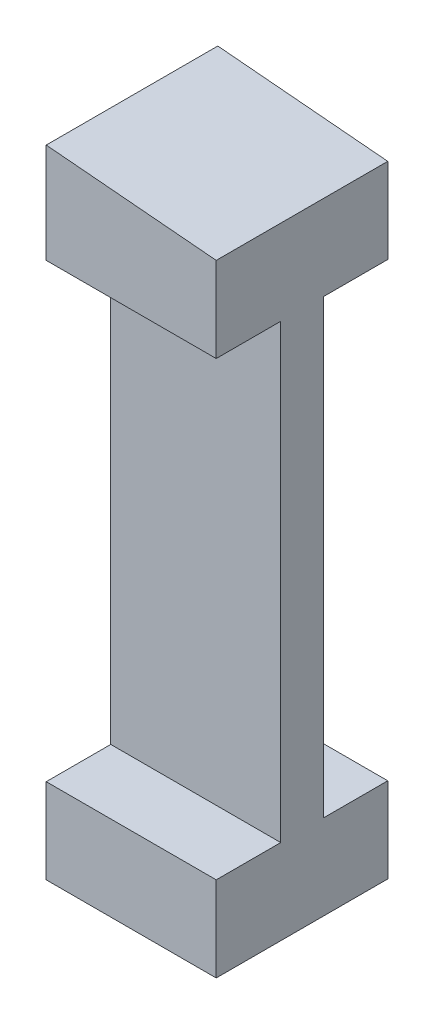
ISO-10303-21;
HEADER;
FILE_DESCRIPTION(('STEP AP214'),'2;1');
FILE_NAME('part.step','',(''),(''),'','','');
FILE_SCHEMA(('AUTOMOTIVE_DESIGN { 1 0 10303 214 1 1 1 1 }'));
ENDSEC;
DATA;
#1=APPLICATION_CONTEXT('core data for automotive mechanical design processes');
#2=APPLICATION_PROTOCOL_DEFINITION('international standard','automotive_design',2000,#1);
#3=PRODUCT_CONTEXT('',#1,'mechanical');
#4=PRODUCT('Part','Part','',(#3));
#5=PRODUCT_RELATED_PRODUCT_CATEGORY('part','',(#4));
#6=PRODUCT_DEFINITION_FORMATION('','',#4);
#7=PRODUCT_DEFINITION_CONTEXT('part definition',#1,'design');
#8=PRODUCT_DEFINITION('design','',#6,#7);
#9=PRODUCT_DEFINITION_SHAPE('','',#8);
#10=(LENGTH_UNIT() NAMED_UNIT(*) SI_UNIT(.MILLI.,.METRE.));
#11=(NAMED_UNIT(*) PLANE_ANGLE_UNIT() SI_UNIT($,.RADIAN.));
#12=(NAMED_UNIT(*) SI_UNIT($,.STERADIAN.) SOLID_ANGLE_UNIT());
#13=UNCERTAINTY_MEASURE_WITH_UNIT(LENGTH_MEASURE(1.E-05),#10,'distance_accuracy_value','');
#14=(GEOMETRIC_REPRESENTATION_CONTEXT(3) GLOBAL_UNCERTAINTY_ASSIGNED_CONTEXT((#13)) GLOBAL_UNIT_ASSIGNED_CONTEXT((#10,
#11,#12)) REPRESENTATION_CONTEXT('',''));
#15=CARTESIAN_POINT('',(0.,0.,0.));
#16=DIRECTION('',(0.,0.,1.));
#17=DIRECTION('',(1.,0.,0.));
#18=AXIS2_PLACEMENT_3D('',#15,#16,#17);
#19=CARTESIAN_POINT('',(-31.5680633759712,0.,10.0267067353836));
#20=DIRECTION('',(0.,0.,-1.));
#21=DIRECTION('',(-1.,0.,0.));
#22=AXIS2_PLACEMENT_3D('',#19,#20,#21);
#23=PLANE('',#22);
#24=DIRECTION('',(-1.,0.,0.));
#25=VECTOR('',#24,1.);
#26=CARTESIAN_POINT('',(-31.5680633759712,252.373598338927,10.0267067353836));
#27=LINE('',#26,#25);
#28=CARTESIAN_POINT('',(48.4000143814819,252.373598338927,10.0267067353836));
#29=VERTEX_POINT('',#28);
#30=CARTESIAN_POINT('',(-31.5680633759712,252.373598338927,10.0267067353836));
#31=VERTEX_POINT('',#30);
#32=EDGE_CURVE('E131',#29,#31,#27,.T.);
#33=ORIENTED_EDGE('',*,*,#32,.T.);
#34=DIRECTION('',(0.,1.,0.));
#35=VECTOR('',#34,1.);
#36=CARTESIAN_POINT('',(-31.5680633759712,0.,10.0267067353836));
#37=LINE('',#36,#35);
#38=CARTESIAN_POINT('',(-31.5680633759712,40.,10.0267067353836));
#39=VERTEX_POINT('',#38);
#40=EDGE_CURVE('E143',#39,#31,#37,.T.);
#41=ORIENTED_EDGE('',*,*,#40,.F.);
#42=DIRECTION('',(1.,0.,0.));
#43=VECTOR('',#42,1.);
#44=CARTESIAN_POINT('',(-31.5680633759712,40.,10.0267067353836));
#45=LINE('',#44,#43);
#46=CARTESIAN_POINT('',(48.4000143814819,40.,10.0267067353836));
#47=VERTEX_POINT('',#46);
#48=EDGE_CURVE('E157',#39,#47,#45,.T.);
#49=ORIENTED_EDGE('',*,*,#48,.T.);
#50=DIRECTION('',(0.,-1.,0.));
#51=VECTOR('',#50,1.);
#52=CARTESIAN_POINT('',(48.4000143814819,409.702848029719,10.0267067353836));
#53=LINE('',#52,#51);
#54=EDGE_CURVE('E46',#29,#47,#53,.T.);
#55=ORIENTED_EDGE('',*,*,#54,.F.);
#56=EDGE_LOOP('',(#33,#41,#49,#55));
#57=FACE_BOUND('',#56,.T.);
#58=ADVANCED_FACE('F38',(#57),#23,.F.);
#59=CARTESIAN_POINT('',(-31.5680633759712,409.702848029719,40.3791279410926));
#60=DIRECTION('',(0.,0.,-1.));
#61=DIRECTION('',(-1.,0.,0.));
#62=AXIS2_PLACEMENT_3D('',#59,#60,#61);
#63=PLANE('',#62);
#64=DIRECTION('',(1.,0.,0.));
#65=VECTOR('',#64,1.);
#66=CARTESIAN_POINT('',(-31.5680633759712,40.,40.3791279410926));
#67=LINE('',#66,#65);
#68=CARTESIAN_POINT('',(-31.5680633759712,40.,40.3791279410926));
#69=VERTEX_POINT('',#68);
#70=CARTESIAN_POINT('',(48.4000143814819,40.,40.3791279410926));
#71=VERTEX_POINT('',#70);
#72=EDGE_CURVE('E151',#69,#71,#67,.T.);
#73=ORIENTED_EDGE('',*,*,#72,.F.);
#74=DIRECTION('',(0.,-1.,0.));
#75=VECTOR('',#74,1.);
#76=CARTESIAN_POINT('',(-31.5680633759712,409.702848029719,40.3791279410926));
#77=LINE('',#76,#75);
#78=CARTESIAN_POINT('',(-31.5680633759712,0.,40.3791279410926));
#79=VERTEX_POINT('',#78);
#80=EDGE_CURVE('E200',#69,#79,#77,.T.);
#81=ORIENTED_EDGE('',*,*,#80,.T.);
#82=DIRECTION('',(1.,0.,0.));
#83=VECTOR('',#82,1.);
#84=CARTESIAN_POINT('',(-31.5680633759712,0.,40.3791279410926));
#85=LINE('',#84,#83);
#86=CARTESIAN_POINT('',(48.4000143814819,0.,40.3791279410926));
#87=VERTEX_POINT('',#86);
#88=EDGE_CURVE('E194',#79,#87,#85,.T.);
#89=ORIENTED_EDGE('',*,*,#88,.T.);
#90=DIRECTION('',(0.,-1.,0.));
#91=VECTOR('',#90,1.);
#92=CARTESIAN_POINT('',(48.4000143814819,409.702848029719,40.3791279410926));
#93=LINE('',#92,#91);
#94=EDGE_CURVE('E197',#71,#87,#93,.T.);
#95=ORIENTED_EDGE('',*,*,#94,.F.);
#96=EDGE_LOOP('',(#73,#81,#89,#95));
#97=FACE_BOUND('',#96,.T.);
#98=ADVANCED_FACE('F227',(#97),#63,.F.);
#99=CARTESIAN_POINT('',(-31.5680633759712,409.702848029719,40.3791279410926));
#100=DIRECTION('',(1.,0.,0.));
#101=DIRECTION('',(0.,0.,-1.));
#102=AXIS2_PLACEMENT_3D('',#99,#100,#101);
#103=PLANE('',#102);
#104=DIRECTION('',(0.,0.,1.));
#105=VECTOR('',#104,1.);
#106=CARTESIAN_POINT('',(-31.5680633759712,40.,0.));
#107=LINE('',#106,#105);
#108=EDGE_CURVE('E148',#39,#69,#107,.T.);
#109=ORIENTED_EDGE('',*,*,#108,.F.);
#110=ORIENTED_EDGE('',*,*,#40,.T.);
#111=DIRECTION('',(0.,0.,1.));
#112=VECTOR('',#111,1.);
#113=CARTESIAN_POINT('',(-31.5680633759712,252.373598338927,40.3791279410926));
#114=LINE('',#113,#112);
#115=CARTESIAN_POINT('',(-31.5680633759712,252.373598338927,40.3791279410926));
#116=VERTEX_POINT('',#115);
#117=EDGE_CURVE('E127',#31,#116,#114,.T.);
#118=ORIENTED_EDGE('',*,*,#117,.T.);
#119=CARTESIAN_POINT('',(-31.5680633759712,299.369898586663,40.3791279410926));
#120=VERTEX_POINT('',#119);
#121=EDGE_CURVE('E201',#120,#116,#77,.T.);
#122=ORIENTED_EDGE('',*,*,#121,.F.);
#123=DIRECTION('',(0.,0.,-1.));
#124=VECTOR('',#123,1.);
#125=CARTESIAN_POINT('',(-31.5680633759712,299.369898586663,40.3791279410926));
#126=LINE('',#125,#124);
#127=CARTESIAN_POINT('',(-31.5680633759712,299.369898586663,-40.3257144703254));
#128=VERTEX_POINT('',#127);
#129=EDGE_CURVE('E177',#120,#128,#126,.T.);
#130=ORIENTED_EDGE('',*,*,#129,.T.);
#131=DIRECTION('',(0.,-1.,0.));
#132=VECTOR('',#131,1.);
#133=CARTESIAN_POINT('',(-31.5680633759712,409.702848029719,-40.3257144703254));
#134=LINE('',#133,#132);
#135=CARTESIAN_POINT('',(-31.5680633759712,252.373598338927,-40.3257144703254));
#136=VERTEX_POINT('',#135);
#137=EDGE_CURVE('E204',#128,#136,#134,.T.);
#138=ORIENTED_EDGE('',*,*,#137,.T.);
#139=DIRECTION('',(0.,0.,1.));
#140=VECTOR('',#139,1.);
#141=CARTESIAN_POINT('',(-31.5680633759712,252.373598338927,0.));
#142=LINE('',#141,#140);
#143=CARTESIAN_POINT('',(-31.5680633759712,252.373598338927,-9.97329326461635));
#144=VERTEX_POINT('',#143);
#145=EDGE_CURVE('E161',#136,#144,#142,.T.);
#146=ORIENTED_EDGE('',*,*,#145,.T.);
#147=DIRECTION('',(0.,-1.,0.));
#148=VECTOR('',#147,1.);
#149=CARTESIAN_POINT('',(-31.5680633759712,0.,-9.97329326461634));
#150=LINE('',#149,#148);
#151=CARTESIAN_POINT('',(-31.5680633759712,40.,-9.97329326461634));
#152=VERTEX_POINT('',#151);
#153=EDGE_CURVE('E164',#144,#152,#150,.T.);
#154=ORIENTED_EDGE('',*,*,#153,.T.);
#155=DIRECTION('',(0.,0.,-1.));
#156=VECTOR('',#155,1.);
#157=CARTESIAN_POINT('',(-31.5680633759712,40.,0.));
#158=LINE('',#157,#156);
#159=CARTESIAN_POINT('',(-31.5680633759712,40.,-40.3257144703254));
#160=VERTEX_POINT('',#159);
#161=EDGE_CURVE('E168',#152,#160,#158,.T.);
#162=ORIENTED_EDGE('',*,*,#161,.T.);
#163=CARTESIAN_POINT('',(-31.5680633759712,0.,-40.3257144703254));
#164=VERTEX_POINT('',#163);
#165=EDGE_CURVE('E203',#160,#164,#134,.T.);
#166=ORIENTED_EDGE('',*,*,#165,.T.);
#167=DIRECTION('',(0.,0.,1.));
#168=VECTOR('',#167,1.);
#169=CARTESIAN_POINT('',(-31.5680633759712,0.,40.3791279410926));
#170=LINE('',#169,#168);
#171=EDGE_CURVE('E191',#164,#79,#170,.T.);
#172=ORIENTED_EDGE('',*,*,#171,.T.);
#173=ORIENTED_EDGE('',*,*,#80,.F.);
#174=EDGE_LOOP('',(#109,#110,#118,#122,#130,#138,#146,#154,#162,#166,#172,#173));
#175=FACE_BOUND('',#174,.T.);
#176=ADVANCED_FACE('F146',(#175),#103,.F.);
#177=CARTESIAN_POINT('',(-31.5680633759712,409.702848029719,-40.3257144703254));
#178=DIRECTION('',(0.,0.,1.));
#179=DIRECTION('',(1.,0.,0.));
#180=AXIS2_PLACEMENT_3D('',#177,#178,#179);
#181=PLANE('',#180);
#182=DIRECTION('',(0.,-1.,0.));
#183=VECTOR('',#182,1.);
#184=CARTESIAN_POINT('',(48.4000143814819,409.702848029719,-40.3257144703254));
#185=LINE('',#184,#183);
#186=CARTESIAN_POINT('',(48.4000143814819,292.373598338927,-40.3257144703254));
#187=VERTEX_POINT('',#186);
#188=CARTESIAN_POINT('',(48.4000143814819,252.373598338927,-40.3257144703254));
#189=VERTEX_POINT('',#188);
#190=EDGE_CURVE('E208',#187,#189,#185,.T.);
#191=ORIENTED_EDGE('',*,*,#190,.T.);
#192=DIRECTION('',(1.,0.,0.));
#193=VECTOR('',#192,1.);
#194=CARTESIAN_POINT('',(-31.5680633759712,252.373598338927,-40.3257144703254));
#195=LINE('',#194,#193);
#196=EDGE_CURVE('E149',#136,#189,#195,.T.);
#197=ORIENTED_EDGE('',*,*,#196,.F.);
#198=ORIENTED_EDGE('',*,*,#137,.F.);
#199=DIRECTION('',(0.996194698091746,-0.0871557427476516,0.));
#200=VECTOR('',#199,1.);
#201=CARTESIAN_POINT('',(-41.1476211796726,300.208001296078,-40.3257144703254));
#202=LINE('',#201,#200);
#203=EDGE_CURVE('E61',#128,#187,#202,.T.);
#204=ORIENTED_EDGE('',*,*,#203,.T.);
#205=EDGE_LOOP('',(#191,#197,#198,#204));
#206=FACE_BOUND('',#205,.T.);
#207=ADVANCED_FACE('F246',(#206),#181,.F.);
#208=CARTESIAN_POINT('',(48.4000143814819,409.702848029719,40.3791279410926));
#209=DIRECTION('',(-1.,0.,0.));
#210=DIRECTION('',(0.,0.,1.));
#211=AXIS2_PLACEMENT_3D('',#208,#209,#210);
#212=PLANE('',#211);
#213=DIRECTION('',(0.,0.,-1.));
#214=VECTOR('',#213,1.);
#215=CARTESIAN_POINT('',(48.4000143814819,252.373598338927,10.0267067353836));
#216=LINE('',#215,#214);
#217=CARTESIAN_POINT('',(48.4000143814819,252.373598338927,40.3791279410926));
#218=VERTEX_POINT('',#217);
#219=EDGE_CURVE('E165',#218,#29,#216,.T.);
#220=ORIENTED_EDGE('',*,*,#219,.T.);
#221=ORIENTED_EDGE('',*,*,#54,.T.);
#222=DIRECTION('',(0.,0.,-1.));
#223=VECTOR('',#222,1.);
#224=CARTESIAN_POINT('',(48.4000143814819,40.,40.3791279410926));
#225=LINE('',#224,#223);
#226=EDGE_CURVE('E11',#71,#47,#225,.T.);
#227=ORIENTED_EDGE('',*,*,#226,.F.);
#228=ORIENTED_EDGE('',*,*,#94,.T.);
#229=DIRECTION('',(0.,0.,-1.));
#230=VECTOR('',#229,1.);
#231=CARTESIAN_POINT('',(48.4000143814819,0.,40.3791279410926));
#232=LINE('',#231,#230);
#233=CARTESIAN_POINT('',(48.4000143814819,0.,-40.3257144703254));
#234=VERTEX_POINT('',#233);
#235=EDGE_CURVE('E159',#87,#234,#232,.T.);
#236=ORIENTED_EDGE('',*,*,#235,.T.);
#237=CARTESIAN_POINT('',(48.4000143814819,40.,-40.3257144703254));
#238=VERTEX_POINT('',#237);
#239=EDGE_CURVE('E207',#238,#234,#185,.T.);
#240=ORIENTED_EDGE('',*,*,#239,.F.);
#241=DIRECTION('',(0.,0.,1.));
#242=VECTOR('',#241,1.);
#243=CARTESIAN_POINT('',(48.4000143814819,40.,40.3791279410926));
#244=LINE('',#243,#242);
#245=CARTESIAN_POINT('',(48.4000143814819,40.,-9.97329326461634));
#246=VERTEX_POINT('',#245);
#247=EDGE_CURVE('E215',#238,#246,#244,.T.);
#248=ORIENTED_EDGE('',*,*,#247,.T.);
#249=DIRECTION('',(0.,1.,0.));
#250=VECTOR('',#249,1.);
#251=CARTESIAN_POINT('',(48.4000143814819,409.702848029719,-9.97329326461634));
#252=LINE('',#251,#250);
#253=CARTESIAN_POINT('',(48.4000143814819,252.373598338927,-9.97329326461634));
#254=VERTEX_POINT('',#253);
#255=EDGE_CURVE('E185',#246,#254,#252,.T.);
#256=ORIENTED_EDGE('',*,*,#255,.T.);
#257=DIRECTION('',(0.,0.,-1.));
#258=VECTOR('',#257,1.);
#259=CARTESIAN_POINT('',(48.4000143814819,252.373598338927,40.3791279410926));
#260=LINE('',#259,#258);
#261=EDGE_CURVE('E218',#254,#189,#260,.T.);
#262=ORIENTED_EDGE('',*,*,#261,.T.);
#263=ORIENTED_EDGE('',*,*,#190,.F.);
#264=DIRECTION('',(0.,0.,1.));
#265=VECTOR('',#264,1.);
#266=CARTESIAN_POINT('',(48.4000143814819,292.373598338927,40.3791279410926));
#267=LINE('',#266,#265);
#268=CARTESIAN_POINT('',(48.4000143814819,292.373598338927,40.3791279410926));
#269=VERTEX_POINT('',#268);
#270=EDGE_CURVE('E182',#187,#269,#267,.T.);
#271=ORIENTED_EDGE('',*,*,#270,.T.);
#272=EDGE_CURVE('E198',#269,#218,#93,.T.);
#273=ORIENTED_EDGE('',*,*,#272,.T.);
#274=EDGE_LOOP('',(#220,#221,#227,#228,#236,#240,#248,#256,#262,#263,#271,#273));
#275=FACE_BOUND('',#274,.T.);
#276=ADVANCED_FACE('F40',(#275),#212,.F.);
#277=CARTESIAN_POINT('',(0.,0.,0.));
#278=DIRECTION('',(0.,-1.,0.));
#279=DIRECTION('',(0.,0.,-1.));
#280=AXIS2_PLACEMENT_3D('',#277,#278,#279);
#281=PLANE('',#280);
#282=ORIENTED_EDGE('',*,*,#235,.F.);
#283=ORIENTED_EDGE('',*,*,#88,.F.);
#284=ORIENTED_EDGE('',*,*,#171,.F.);
#285=DIRECTION('',(-1.,0.,0.));
#286=VECTOR('',#285,1.);
#287=CARTESIAN_POINT('',(-31.5680633759712,0.,-40.3257144703254));
#288=LINE('',#287,#286);
#289=EDGE_CURVE('E188',#234,#164,#288,.T.);
#290=ORIENTED_EDGE('',*,*,#289,.F.);
#291=EDGE_LOOP('',(#282,#283,#284,#290));
#292=FACE_BOUND('',#291,.T.);
#293=ADVANCED_FACE('F234',(#292),#281,.T.);
#294=ORIENTED_EDGE('',*,*,#121,.T.);
#295=DIRECTION('',(1.,0.,0.));
#296=VECTOR('',#295,1.);
#297=CARTESIAN_POINT('',(48.4000143814819,252.373598338927,40.3791279410926));
#298=LINE('',#297,#296);
#299=EDGE_CURVE('E134',#116,#218,#298,.T.);
#300=ORIENTED_EDGE('',*,*,#299,.T.);
#301=ORIENTED_EDGE('',*,*,#272,.F.);
#302=DIRECTION('',(-0.996194698091746,0.0871557427476516,0.));
#303=VECTOR('',#302,1.);
#304=CARTESIAN_POINT('',(-41.1476211796726,300.208001296078,40.3791279410926));
#305=LINE('',#304,#303);
#306=EDGE_CURVE('E180',#269,#120,#305,.T.);
#307=ORIENTED_EDGE('',*,*,#306,.T.);
#308=EDGE_LOOP('',(#294,#300,#301,#307));
#309=FACE_BOUND('',#308,.T.);
#310=ADVANCED_FACE('F250',(#309),#63,.F.);
#311=ORIENTED_EDGE('',*,*,#165,.F.);
#312=DIRECTION('',(1.,0.,0.));
#313=VECTOR('',#312,1.);
#314=CARTESIAN_POINT('',(-31.5680633759712,40.,-40.3257144703254));
#315=LINE('',#314,#313);
#316=EDGE_CURVE('E153',#160,#238,#315,.T.);
#317=ORIENTED_EDGE('',*,*,#316,.T.);
#318=ORIENTED_EDGE('',*,*,#239,.T.);
#319=ORIENTED_EDGE('',*,*,#289,.T.);
#320=EDGE_LOOP('',(#311,#317,#318,#319));
#321=FACE_BOUND('',#320,.T.);
#322=ADVANCED_FACE('F237',(#321),#181,.F.);
#323=CARTESIAN_POINT('',(468.241671528616,255.642212862617,-89.2232932646161));
#324=DIRECTION('',(-0.0871557427476516,-0.996194698091746,0.));
#325=DIRECTION('',(0.996194698091746,-0.0871557427476516,0.));
#326=AXIS2_PLACEMENT_3D('',#323,#324,#325);
#327=PLANE('',#326);
#328=ORIENTED_EDGE('',*,*,#203,.F.);
#329=ORIENTED_EDGE('',*,*,#129,.F.);
#330=ORIENTED_EDGE('',*,*,#306,.F.);
#331=ORIENTED_EDGE('',*,*,#270,.F.);
#332=EDGE_LOOP('',(#328,#329,#330,#331));
#333=FACE_BOUND('',#332,.T.);
#334=ADVANCED_FACE('F247',(#333),#327,.F.);
#335=CARTESIAN_POINT('',(-31.5680633759712,252.373598338927,0.));
#336=DIRECTION('',(0.,1.,0.));
#337=DIRECTION('',(0.,0.,1.));
#338=AXIS2_PLACEMENT_3D('',#335,#336,#337);
#339=PLANE('',#338);
#340=DIRECTION('',(1.,0.,0.));
#341=VECTOR('',#340,1.);
#342=CARTESIAN_POINT('',(-31.5680633759712,252.373598338927,-9.97329326461635));
#343=LINE('',#342,#341);
#344=EDGE_CURVE('E53',#144,#254,#343,.T.);
#345=ORIENTED_EDGE('',*,*,#344,.F.);
#346=ORIENTED_EDGE('',*,*,#145,.F.);
#347=ORIENTED_EDGE('',*,*,#196,.T.);
#348=ORIENTED_EDGE('',*,*,#261,.F.);
#349=EDGE_LOOP('',(#345,#346,#347,#348));
#350=FACE_BOUND('',#349,.T.);
#351=ADVANCED_FACE('F270',(#350),#339,.F.);
#352=CARTESIAN_POINT('',(-31.5680633759712,40.,0.));
#353=DIRECTION('',(0.,-1.,0.));
#354=DIRECTION('',(0.,0.,-1.));
#355=AXIS2_PLACEMENT_3D('',#352,#353,#354);
#356=PLANE('',#355);
#357=ORIENTED_EDGE('',*,*,#316,.F.);
#358=ORIENTED_EDGE('',*,*,#161,.F.);
#359=DIRECTION('',(1.,0.,0.));
#360=VECTOR('',#359,1.);
#361=CARTESIAN_POINT('',(-31.5680633759712,40.,-9.97329326461634));
#362=LINE('',#361,#360);
#363=EDGE_CURVE('E173',#152,#246,#362,.T.);
#364=ORIENTED_EDGE('',*,*,#363,.T.);
#365=ORIENTED_EDGE('',*,*,#247,.F.);
#366=EDGE_LOOP('',(#357,#358,#364,#365));
#367=FACE_BOUND('',#366,.T.);
#368=ADVANCED_FACE('F240',(#367),#356,.F.);
#369=CARTESIAN_POINT('',(-31.5680633759712,0.,-9.97329326461634));
#370=DIRECTION('',(0.,0.,1.));
#371=DIRECTION('',(0.,-1.,0.));
#372=AXIS2_PLACEMENT_3D('',#369,#370,#371);
#373=PLANE('',#372);
#374=ORIENTED_EDGE('',*,*,#363,.F.);
#375=ORIENTED_EDGE('',*,*,#153,.F.);
#376=ORIENTED_EDGE('',*,*,#344,.T.);
#377=ORIENTED_EDGE('',*,*,#255,.F.);
#378=EDGE_LOOP('',(#374,#375,#376,#377));
#379=FACE_BOUND('',#378,.T.);
#380=ADVANCED_FACE('F241',(#379),#373,.F.);
#381=CARTESIAN_POINT('',(-31.5680633759712,40.,0.));
#382=DIRECTION('',(0.,1.,0.));
#383=DIRECTION('',(0.,0.,1.));
#384=AXIS2_PLACEMENT_3D('',#381,#382,#383);
#385=PLANE('',#384);
#386=ORIENTED_EDGE('',*,*,#226,.T.);
#387=ORIENTED_EDGE('',*,*,#48,.F.);
#388=ORIENTED_EDGE('',*,*,#108,.T.);
#389=ORIENTED_EDGE('',*,*,#72,.T.);
#390=EDGE_LOOP('',(#386,#387,#388,#389));
#391=FACE_BOUND('',#390,.T.);
#392=ADVANCED_FACE('F224',(#391),#385,.T.);
#393=CARTESIAN_POINT('',(-31.5680633759712,252.373598338927,0.));
#394=DIRECTION('',(0.,1.,0.));
#395=DIRECTION('',(0.,0.,1.));
#396=AXIS2_PLACEMENT_3D('',#393,#394,#395);
#397=PLANE('',#396);
#398=ORIENTED_EDGE('',*,*,#299,.F.);
#399=ORIENTED_EDGE('',*,*,#117,.F.);
#400=ORIENTED_EDGE('',*,*,#32,.F.);
#401=ORIENTED_EDGE('',*,*,#219,.F.);
#402=EDGE_LOOP('',(#398,#399,#400,#401));
#403=FACE_BOUND('',#402,.T.);
#404=ADVANCED_FACE('F129',(#403),#397,.F.);
#405=CLOSED_SHELL('',(#58,#98,#176,#207,#276,#293,#310,#322,#334,#351,#368,#380,#392,#404));
#406=MANIFOLD_SOLID_BREP('B2',#405);
#407=ADVANCED_BREP_SHAPE_REPRESENTATION('',(#18,#406),#14);
#408=SHAPE_DEFINITION_REPRESENTATION(#9,#407);
ENDSEC;
END-ISO-10303-21;
